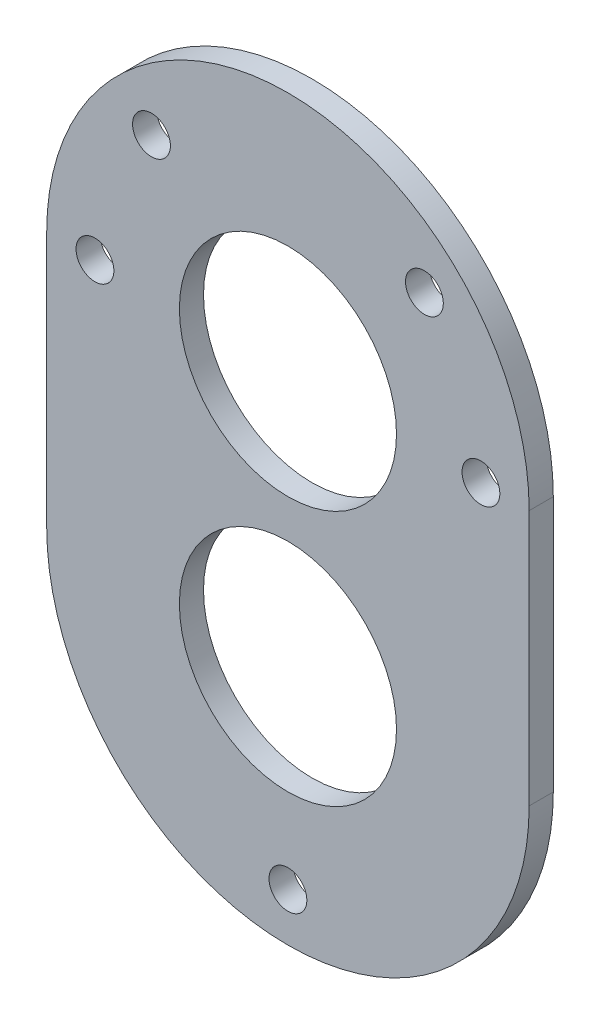
ISO-10303-21;
HEADER;
FILE_DESCRIPTION(('STEP AP214'),'2;1');
FILE_NAME('part.step','',(''),(''),'','','');
FILE_SCHEMA(('AUTOMOTIVE_DESIGN { 1 0 10303 214 1 1 1 1 }'));
ENDSEC;
DATA;
#1=APPLICATION_CONTEXT('core data for automotive mechanical design processes');
#2=APPLICATION_PROTOCOL_DEFINITION('international standard','automotive_design',2000,#1);
#3=PRODUCT_CONTEXT('',#1,'mechanical');
#4=PRODUCT('Part','Part','',(#3));
#5=PRODUCT_RELATED_PRODUCT_CATEGORY('part','',(#4));
#6=PRODUCT_DEFINITION_FORMATION('','',#4);
#7=PRODUCT_DEFINITION_CONTEXT('part definition',#1,'design');
#8=PRODUCT_DEFINITION('design','',#6,#7);
#9=PRODUCT_DEFINITION_SHAPE('','',#8);
#10=(LENGTH_UNIT() NAMED_UNIT(*) SI_UNIT(.MILLI.,.METRE.));
#11=(NAMED_UNIT(*) PLANE_ANGLE_UNIT() SI_UNIT($,.RADIAN.));
#12=(NAMED_UNIT(*) SI_UNIT($,.STERADIAN.) SOLID_ANGLE_UNIT());
#13=UNCERTAINTY_MEASURE_WITH_UNIT(LENGTH_MEASURE(1.E-05),#10,'distance_accuracy_value','');
#14=(GEOMETRIC_REPRESENTATION_CONTEXT(3) GLOBAL_UNCERTAINTY_ASSIGNED_CONTEXT((#13)) GLOBAL_UNIT_ASSIGNED_CONTEXT((#10,
#11,#12)) REPRESENTATION_CONTEXT('',''));
#15=CARTESIAN_POINT('',(0.,0.,0.));
#16=DIRECTION('',(0.,0.,1.));
#17=DIRECTION('',(1.,0.,0.));
#18=AXIS2_PLACEMENT_3D('',#15,#16,#17);
#19=CARTESIAN_POINT('',(0.,-33.655,3.175));
#20=DIRECTION('',(0.,0.,1.));
#21=DIRECTION('',(1.,0.,0.));
#22=AXIS2_PLACEMENT_3D('',#19,#20,#21);
#23=PLANE('',#22);
#24=CARTESIAN_POINT('',(-25.4,0.,3.175));
#25=DIRECTION('',(0.,0.,1.));
#26=DIRECTION('',(1.,0.,0.));
#27=AXIS2_PLACEMENT_3D('',#24,#25,#26);
#28=CIRCLE('',#27,2.48919999999999);
#29=CARTESIAN_POINT('',(-22.9108,0.,3.175));
#30=VERTEX_POINT('',#29);
#31=EDGE_CURVE('E187',#30,#30,#28,.T.);
#32=ORIENTED_EDGE('',*,*,#31,.F.);
#33=EDGE_LOOP('',(#32));
#34=FACE_BOUND('',#33,.T.);
#35=CARTESIAN_POINT('',(25.4,0.,3.175));
#36=DIRECTION('',(0.,0.,1.));
#37=DIRECTION('',(1.,0.,0.));
#38=AXIS2_PLACEMENT_3D('',#35,#36,#37);
#39=CIRCLE('',#38,2.48919999999999);
#40=CARTESIAN_POINT('',(27.8892,0.,3.175));
#41=VERTEX_POINT('',#40);
#42=EDGE_CURVE('E179',#41,#41,#39,.T.);
#43=ORIENTED_EDGE('',*,*,#42,.F.);
#44=EDGE_LOOP('',(#43));
#45=FACE_BOUND('',#44,.T.);
#46=CARTESIAN_POINT('',(0.,-59.055,3.175));
#47=DIRECTION('',(0.,0.,1.));
#48=DIRECTION('',(1.,0.,0.));
#49=AXIS2_PLACEMENT_3D('',#46,#47,#48);
#50=CIRCLE('',#49,2.48919999999999);
#51=CARTESIAN_POINT('',(2.48919999999999,-59.055,3.175));
#52=VERTEX_POINT('',#51);
#53=EDGE_CURVE('E171',#52,#52,#50,.T.);
#54=ORIENTED_EDGE('',*,*,#53,.F.);
#55=EDGE_LOOP('',(#54));
#56=FACE_BOUND('',#55,.T.);
#57=CARTESIAN_POINT('',(-17.9605122421383,17.9605122421383,3.175));
#58=DIRECTION('',(0.,0.,1.));
#59=DIRECTION('',(1.,0.,0.));
#60=AXIS2_PLACEMENT_3D('',#57,#58,#59);
#61=CIRCLE('',#60,2.48919999999999);
#62=CARTESIAN_POINT('',(-15.4713122421383,17.9605122421383,3.175));
#63=VERTEX_POINT('',#62);
#64=EDGE_CURVE('E163',#63,#63,#61,.T.);
#65=ORIENTED_EDGE('',*,*,#64,.F.);
#66=EDGE_LOOP('',(#65));
#67=FACE_BOUND('',#66,.T.);
#68=CARTESIAN_POINT('',(17.9605122421383,17.9605122421383,3.175));
#69=DIRECTION('',(0.,0.,1.));
#70=DIRECTION('',(1.,0.,0.));
#71=AXIS2_PLACEMENT_3D('',#68,#69,#70);
#72=CIRCLE('',#71,2.48919999999999);
#73=CARTESIAN_POINT('',(20.4497122421383,17.9605122421383,3.175));
#74=VERTEX_POINT('',#73);
#75=EDGE_CURVE('E155',#74,#74,#72,.T.);
#76=ORIENTED_EDGE('',*,*,#75,.F.);
#77=EDGE_LOOP('',(#76));
#78=FACE_BOUND('',#77,.T.);
#79=CARTESIAN_POINT('',(0.,0.,3.175));
#80=DIRECTION('',(0.,0.,1.));
#81=DIRECTION('',(1.,0.,0.));
#82=AXIS2_PLACEMENT_3D('',#79,#80,#81);
#83=CIRCLE('',#82,14.2875);
#84=CARTESIAN_POINT('',(14.2875,0.,3.175));
#85=VERTEX_POINT('',#84);
#86=EDGE_CURVE('E118',#85,#85,#83,.T.);
#87=ORIENTED_EDGE('',*,*,#86,.F.);
#88=EDGE_LOOP('',(#87));
#89=FACE_BOUND('',#88,.T.);
#90=CARTESIAN_POINT('',(0.,-33.655,3.175));
#91=DIRECTION('',(0.,0.,1.));
#92=DIRECTION('',(1.,0.,0.));
#93=AXIS2_PLACEMENT_3D('',#90,#91,#92);
#94=CIRCLE('',#93,31.75);
#95=CARTESIAN_POINT('',(-31.75,-33.655,3.175));
#96=VERTEX_POINT('',#95);
#97=CARTESIAN_POINT('',(31.75,-33.655,3.175));
#98=VERTEX_POINT('',#97);
#99=EDGE_CURVE('E98',#96,#98,#94,.T.);
#100=ORIENTED_EDGE('',*,*,#99,.T.);
#101=DIRECTION('',(0.,1.,0.));
#102=VECTOR('',#101,1.);
#103=CARTESIAN_POINT('',(31.75,-33.655,3.175));
#104=LINE('',#103,#102);
#105=CARTESIAN_POINT('',(31.75,0.,3.175));
#106=VERTEX_POINT('',#105);
#107=EDGE_CURVE('E93',#98,#106,#104,.T.);
#108=ORIENTED_EDGE('',*,*,#107,.T.);
#109=CARTESIAN_POINT('',(0.,0.,3.175));
#110=DIRECTION('',(0.,0.,1.));
#111=DIRECTION('',(1.,0.,0.));
#112=AXIS2_PLACEMENT_3D('',#109,#110,#111);
#113=CIRCLE('',#112,31.75);
#114=CARTESIAN_POINT('',(-31.75,0.,3.175));
#115=VERTEX_POINT('',#114);
#116=EDGE_CURVE('E96',#106,#115,#113,.T.);
#117=ORIENTED_EDGE('',*,*,#116,.T.);
#118=DIRECTION('',(0.,-1.,0.));
#119=VECTOR('',#118,1.);
#120=CARTESIAN_POINT('',(-31.75,-33.655,3.175));
#121=LINE('',#120,#119);
#122=EDGE_CURVE('E63',#115,#96,#121,.T.);
#123=ORIENTED_EDGE('',*,*,#122,.T.);
#124=EDGE_LOOP('',(#100,#108,#117,#123));
#125=FACE_BOUND('',#124,.T.);
#126=CARTESIAN_POINT('',(0.,-33.655,3.175));
#127=DIRECTION('',(0.,0.,1.));
#128=DIRECTION('',(1.,0.,0.));
#129=AXIS2_PLACEMENT_3D('',#126,#127,#128);
#130=CIRCLE('',#129,14.2875);
#131=CARTESIAN_POINT('',(14.2875,-33.655,3.175));
#132=VERTEX_POINT('',#131);
#133=EDGE_CURVE('E140',#132,#132,#130,.T.);
#134=ORIENTED_EDGE('',*,*,#133,.F.);
#135=EDGE_LOOP('',(#134));
#136=FACE_BOUND('',#135,.T.);
#137=ADVANCED_FACE('F45',(#34,#45,#56,#67,#78,#89,#125,#136),#23,.T.);
#138=CARTESIAN_POINT('',(0.,-33.655,0.));
#139=DIRECTION('',(0.,0.,1.));
#140=DIRECTION('',(1.,0.,0.));
#141=AXIS2_PLACEMENT_3D('',#138,#139,#140);
#142=PLANE('',#141);
#143=CARTESIAN_POINT('',(-25.4,0.,0.));
#144=DIRECTION('',(0.,0.,1.));
#145=DIRECTION('',(1.,0.,0.));
#146=AXIS2_PLACEMENT_3D('',#143,#144,#145);
#147=CIRCLE('',#146,2.4892);
#148=CARTESIAN_POINT('',(-22.9108,0.,0.));
#149=VERTEX_POINT('',#148);
#150=EDGE_CURVE('E183',#149,#149,#147,.T.);
#151=ORIENTED_EDGE('',*,*,#150,.T.);
#152=EDGE_LOOP('',(#151));
#153=FACE_BOUND('',#152,.T.);
#154=CARTESIAN_POINT('',(25.4,0.,0.));
#155=DIRECTION('',(0.,0.,1.));
#156=DIRECTION('',(1.,0.,0.));
#157=AXIS2_PLACEMENT_3D('',#154,#155,#156);
#158=CIRCLE('',#157,2.4892);
#159=CARTESIAN_POINT('',(27.8892,0.,0.));
#160=VERTEX_POINT('',#159);
#161=EDGE_CURVE('E175',#160,#160,#158,.T.);
#162=ORIENTED_EDGE('',*,*,#161,.T.);
#163=EDGE_LOOP('',(#162));
#164=FACE_BOUND('',#163,.T.);
#165=CARTESIAN_POINT('',(0.,-59.055,0.));
#166=DIRECTION('',(0.,0.,1.));
#167=DIRECTION('',(1.,0.,0.));
#168=AXIS2_PLACEMENT_3D('',#165,#166,#167);
#169=CIRCLE('',#168,2.4892);
#170=CARTESIAN_POINT('',(2.4892,-59.055,0.));
#171=VERTEX_POINT('',#170);
#172=EDGE_CURVE('E167',#171,#171,#169,.T.);
#173=ORIENTED_EDGE('',*,*,#172,.T.);
#174=EDGE_LOOP('',(#173));
#175=FACE_BOUND('',#174,.T.);
#176=CARTESIAN_POINT('',(-17.9605122421383,17.9605122421383,0.));
#177=DIRECTION('',(0.,0.,1.));
#178=DIRECTION('',(1.,0.,0.));
#179=AXIS2_PLACEMENT_3D('',#176,#177,#178);
#180=CIRCLE('',#179,2.4892);
#181=CARTESIAN_POINT('',(-15.4713122421383,17.9605122421383,0.));
#182=VERTEX_POINT('',#181);
#183=EDGE_CURVE('E159',#182,#182,#180,.T.);
#184=ORIENTED_EDGE('',*,*,#183,.T.);
#185=EDGE_LOOP('',(#184));
#186=FACE_BOUND('',#185,.T.);
#187=CARTESIAN_POINT('',(17.9605122421383,17.9605122421383,0.));
#188=DIRECTION('',(0.,0.,1.));
#189=DIRECTION('',(1.,0.,0.));
#190=AXIS2_PLACEMENT_3D('',#187,#188,#189);
#191=CIRCLE('',#190,2.4892);
#192=CARTESIAN_POINT('',(20.4497122421383,17.9605122421383,0.));
#193=VERTEX_POINT('',#192);
#194=EDGE_CURVE('E148',#193,#193,#191,.T.);
#195=ORIENTED_EDGE('',*,*,#194,.T.);
#196=EDGE_LOOP('',(#195));
#197=FACE_BOUND('',#196,.T.);
#198=CARTESIAN_POINT('',(0.,-33.655,0.));
#199=DIRECTION('',(0.,0.,1.));
#200=DIRECTION('',(1.,0.,0.));
#201=AXIS2_PLACEMENT_3D('',#198,#199,#200);
#202=CIRCLE('',#201,31.75);
#203=CARTESIAN_POINT('',(-31.75,-33.655,0.));
#204=VERTEX_POINT('',#203);
#205=CARTESIAN_POINT('',(31.75,-33.655,0.));
#206=VERTEX_POINT('',#205);
#207=EDGE_CURVE('E114',#204,#206,#202,.T.);
#208=ORIENTED_EDGE('',*,*,#207,.F.);
#209=DIRECTION('',(0.,-1.,0.));
#210=VECTOR('',#209,1.);
#211=CARTESIAN_POINT('',(-31.75,-33.655,0.));
#212=LINE('',#211,#210);
#213=CARTESIAN_POINT('',(-31.75,0.,0.));
#214=VERTEX_POINT('',#213);
#215=EDGE_CURVE('E86',#214,#204,#212,.T.);
#216=ORIENTED_EDGE('',*,*,#215,.F.);
#217=CARTESIAN_POINT('',(0.,0.,0.));
#218=DIRECTION('',(0.,0.,1.));
#219=DIRECTION('',(1.,0.,0.));
#220=AXIS2_PLACEMENT_3D('',#217,#218,#219);
#221=CIRCLE('',#220,31.75);
#222=CARTESIAN_POINT('',(31.75,0.,0.));
#223=VERTEX_POINT('',#222);
#224=EDGE_CURVE('E80',#223,#214,#221,.T.);
#225=ORIENTED_EDGE('',*,*,#224,.F.);
#226=DIRECTION('',(0.,1.,0.));
#227=VECTOR('',#226,1.);
#228=CARTESIAN_POINT('',(31.75,-33.655,0.));
#229=LINE('',#228,#227);
#230=EDGE_CURVE('E103',#206,#223,#229,.T.);
#231=ORIENTED_EDGE('',*,*,#230,.F.);
#232=EDGE_LOOP('',(#208,#216,#225,#231));
#233=FACE_BOUND('',#232,.T.);
#234=CARTESIAN_POINT('',(0.,0.,0.));
#235=DIRECTION('',(0.,0.,1.));
#236=DIRECTION('',(1.,0.,0.));
#237=AXIS2_PLACEMENT_3D('',#234,#235,#236);
#238=CIRCLE('',#237,14.2875);
#239=CARTESIAN_POINT('',(14.2875,0.,0.));
#240=VERTEX_POINT('',#239);
#241=EDGE_CURVE('E136',#240,#240,#238,.T.);
#242=ORIENTED_EDGE('',*,*,#241,.T.);
#243=EDGE_LOOP('',(#242));
#244=FACE_BOUND('',#243,.T.);
#245=CARTESIAN_POINT('',(0.,-33.655,0.));
#246=DIRECTION('',(0.,0.,1.));
#247=DIRECTION('',(1.,0.,0.));
#248=AXIS2_PLACEMENT_3D('',#245,#246,#247);
#249=CIRCLE('',#248,14.2875);
#250=CARTESIAN_POINT('',(14.2875,-33.655,0.));
#251=VERTEX_POINT('',#250);
#252=EDGE_CURVE('E144',#251,#251,#249,.T.);
#253=ORIENTED_EDGE('',*,*,#252,.T.);
#254=EDGE_LOOP('',(#253));
#255=FACE_BOUND('',#254,.T.);
#256=ADVANCED_FACE('F131',(#153,#164,#175,#186,#197,#233,#244,#255),#142,.F.);
#257=CARTESIAN_POINT('',(0.,-33.655,3.175));
#258=DIRECTION('',(0.,0.,-1.));
#259=DIRECTION('',(-1.,0.,0.));
#260=AXIS2_PLACEMENT_3D('',#257,#258,#259);
#261=CYLINDRICAL_SURFACE('',#260,31.75);
#262=ORIENTED_EDGE('',*,*,#207,.T.);
#263=DIRECTION('',(0.,0.,-1.));
#264=VECTOR('',#263,1.);
#265=CARTESIAN_POINT('',(31.75,-33.655,3.175));
#266=LINE('',#265,#264);
#267=EDGE_CURVE('E11',#98,#206,#266,.T.);
#268=ORIENTED_EDGE('',*,*,#267,.F.);
#269=ORIENTED_EDGE('',*,*,#99,.F.);
#270=DIRECTION('',(0.,0.,-1.));
#271=VECTOR('',#270,1.);
#272=CARTESIAN_POINT('',(-31.75,-33.655,3.175));
#273=LINE('',#272,#271);
#274=EDGE_CURVE('E110',#96,#204,#273,.T.);
#275=ORIENTED_EDGE('',*,*,#274,.T.);
#276=EDGE_LOOP('',(#262,#268,#269,#275));
#277=FACE_BOUND('',#276,.T.);
#278=ADVANCED_FACE('F47',(#277),#261,.T.);
#279=CARTESIAN_POINT('',(31.75,-33.655,3.175));
#280=DIRECTION('',(-1.,0.,0.));
#281=DIRECTION('',(0.,0.,1.));
#282=AXIS2_PLACEMENT_3D('',#279,#280,#281);
#283=PLANE('',#282);
#284=ORIENTED_EDGE('',*,*,#230,.T.);
#285=DIRECTION('',(0.,0.,-1.));
#286=VECTOR('',#285,1.);
#287=CARTESIAN_POINT('',(31.75,0.,3.175));
#288=LINE('',#287,#286);
#289=EDGE_CURVE('E55',#106,#223,#288,.T.);
#290=ORIENTED_EDGE('',*,*,#289,.F.);
#291=ORIENTED_EDGE('',*,*,#107,.F.);
#292=ORIENTED_EDGE('',*,*,#267,.T.);
#293=EDGE_LOOP('',(#284,#290,#291,#292));
#294=FACE_BOUND('',#293,.T.);
#295=ADVANCED_FACE('F102',(#294),#283,.F.);
#296=CARTESIAN_POINT('',(0.,0.,3.175));
#297=DIRECTION('',(0.,0.,-1.));
#298=DIRECTION('',(-1.,0.,0.));
#299=AXIS2_PLACEMENT_3D('',#296,#297,#298);
#300=CYLINDRICAL_SURFACE('',#299,31.75);
#301=ORIENTED_EDGE('',*,*,#224,.T.);
#302=DIRECTION('',(0.,0.,-1.));
#303=VECTOR('',#302,1.);
#304=CARTESIAN_POINT('',(-31.75,0.,3.175));
#305=LINE('',#304,#303);
#306=EDGE_CURVE('E105',#115,#214,#305,.T.);
#307=ORIENTED_EDGE('',*,*,#306,.F.);
#308=ORIENTED_EDGE('',*,*,#116,.F.);
#309=ORIENTED_EDGE('',*,*,#289,.T.);
#310=EDGE_LOOP('',(#301,#307,#308,#309));
#311=FACE_BOUND('',#310,.T.);
#312=ADVANCED_FACE('F106',(#311),#300,.T.);
#313=CARTESIAN_POINT('',(-31.75,-33.655,3.175));
#314=DIRECTION('',(1.,0.,0.));
#315=DIRECTION('',(0.,0.,-1.));
#316=AXIS2_PLACEMENT_3D('',#313,#314,#315);
#317=PLANE('',#316);
#318=ORIENTED_EDGE('',*,*,#215,.T.);
#319=ORIENTED_EDGE('',*,*,#274,.F.);
#320=ORIENTED_EDGE('',*,*,#122,.F.);
#321=ORIENTED_EDGE('',*,*,#306,.T.);
#322=EDGE_LOOP('',(#318,#319,#320,#321));
#323=FACE_BOUND('',#322,.T.);
#324=ADVANCED_FACE('F128',(#323),#317,.F.);
#325=CARTESIAN_POINT('',(0.,0.,3.175));
#326=DIRECTION('',(0.,0.,-1.));
#327=DIRECTION('',(-1.,0.,0.));
#328=AXIS2_PLACEMENT_3D('',#325,#326,#327);
#329=CYLINDRICAL_SURFACE('',#328,14.2875);
#330=ORIENTED_EDGE('',*,*,#86,.T.);
#331=EDGE_LOOP('',(#330));
#332=FACE_BOUND('',#331,.T.);
#333=ORIENTED_EDGE('',*,*,#241,.F.);
#334=EDGE_LOOP('',(#333));
#335=FACE_BOUND('',#334,.T.);
#336=ADVANCED_FACE('F207',(#332,#335),#329,.F.);
#337=CARTESIAN_POINT('',(0.,-33.655,3.175));
#338=DIRECTION('',(0.,0.,-1.));
#339=DIRECTION('',(-1.,0.,0.));
#340=AXIS2_PLACEMENT_3D('',#337,#338,#339);
#341=CYLINDRICAL_SURFACE('',#340,14.2875);
#342=ORIENTED_EDGE('',*,*,#133,.T.);
#343=EDGE_LOOP('',(#342));
#344=FACE_BOUND('',#343,.T.);
#345=ORIENTED_EDGE('',*,*,#252,.F.);
#346=EDGE_LOOP('',(#345));
#347=FACE_BOUND('',#346,.T.);
#348=ADVANCED_FACE('F210',(#344,#347),#341,.F.);
#349=CARTESIAN_POINT('',(17.9605122421383,17.9605122421383,3.175));
#350=DIRECTION('',(0.,0.,1.));
#351=DIRECTION('',(1.,0.,0.));
#352=AXIS2_PLACEMENT_3D('',#349,#350,#351);
#353=CYLINDRICAL_SURFACE('',#352,2.4892);
#354=ORIENTED_EDGE('',*,*,#194,.F.);
#355=EDGE_LOOP('',(#354));
#356=FACE_BOUND('',#355,.T.);
#357=ORIENTED_EDGE('',*,*,#75,.T.);
#358=EDGE_LOOP('',(#357));
#359=FACE_BOUND('',#358,.T.);
#360=ADVANCED_FACE('F220',(#356,#359),#353,.F.);
#361=CARTESIAN_POINT('',(-17.9605122421383,17.9605122421383,3.175));
#362=DIRECTION('',(0.,0.,1.));
#363=DIRECTION('',(1.,0.,0.));
#364=AXIS2_PLACEMENT_3D('',#361,#362,#363);
#365=CYLINDRICAL_SURFACE('',#364,2.48919999999999);
#366=ORIENTED_EDGE('',*,*,#183,.F.);
#367=EDGE_LOOP('',(#366));
#368=FACE_BOUND('',#367,.T.);
#369=ORIENTED_EDGE('',*,*,#64,.T.);
#370=EDGE_LOOP('',(#369));
#371=FACE_BOUND('',#370,.T.);
#372=ADVANCED_FACE('F226',(#368,#371),#365,.F.);
#373=CARTESIAN_POINT('',(0.,-59.055,3.175));
#374=DIRECTION('',(0.,0.,1.));
#375=DIRECTION('',(1.,0.,0.));
#376=AXIS2_PLACEMENT_3D('',#373,#374,#375);
#377=CYLINDRICAL_SURFACE('',#376,2.48919999999999);
#378=ORIENTED_EDGE('',*,*,#172,.F.);
#379=EDGE_LOOP('',(#378));
#380=FACE_BOUND('',#379,.T.);
#381=ORIENTED_EDGE('',*,*,#53,.T.);
#382=EDGE_LOOP('',(#381));
#383=FACE_BOUND('',#382,.T.);
#384=ADVANCED_FACE('F287',(#380,#383),#377,.F.);
#385=CARTESIAN_POINT('',(25.4,0.,3.175));
#386=DIRECTION('',(0.,0.,1.));
#387=DIRECTION('',(1.,0.,0.));
#388=AXIS2_PLACEMENT_3D('',#385,#386,#387);
#389=CYLINDRICAL_SURFACE('',#388,2.4892);
#390=ORIENTED_EDGE('',*,*,#161,.F.);
#391=EDGE_LOOP('',(#390));
#392=FACE_BOUND('',#391,.T.);
#393=ORIENTED_EDGE('',*,*,#42,.T.);
#394=EDGE_LOOP('',(#393));
#395=FACE_BOUND('',#394,.T.);
#396=ADVANCED_FACE('F296',(#392,#395),#389,.F.);
#397=CARTESIAN_POINT('',(-25.4,0.,3.175));
#398=DIRECTION('',(0.,0.,1.));
#399=DIRECTION('',(1.,0.,0.));
#400=AXIS2_PLACEMENT_3D('',#397,#398,#399);
#401=CYLINDRICAL_SURFACE('',#400,2.4892);
#402=ORIENTED_EDGE('',*,*,#150,.F.);
#403=EDGE_LOOP('',(#402));
#404=FACE_BOUND('',#403,.T.);
#405=ORIENTED_EDGE('',*,*,#31,.T.);
#406=EDGE_LOOP('',(#405));
#407=FACE_BOUND('',#406,.T.);
#408=ADVANCED_FACE('F192',(#404,#407),#401,.F.);
#409=CLOSED_SHELL('',(#137,#256,#278,#295,#312,#324,#336,#348,#360,#372,#384,#396,#408));
#410=MANIFOLD_SOLID_BREP('B2',#409);
#411=ADVANCED_BREP_SHAPE_REPRESENTATION('',(#18,#410),#14);
#412=SHAPE_DEFINITION_REPRESENTATION(#9,#411);
ENDSEC;
END-ISO-10303-21;
